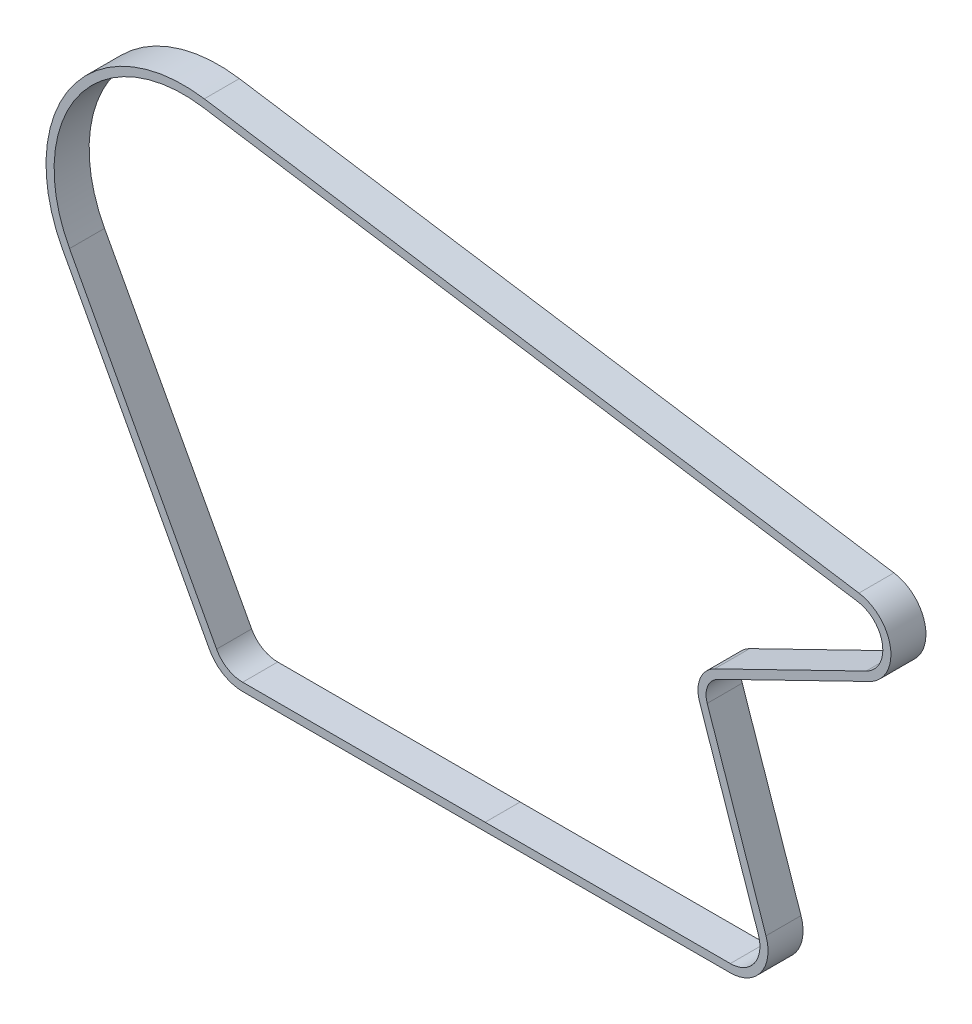
ISO-10303-21;
HEADER;
FILE_DESCRIPTION(('STEP AP214'),'2;1');
FILE_NAME('part.step','',(''),(''),'','','');
FILE_SCHEMA(('AUTOMOTIVE_DESIGN { 1 0 10303 214 1 1 1 1 }'));
ENDSEC;
DATA;
#1=APPLICATION_CONTEXT('core data for automotive mechanical design processes');
#2=APPLICATION_PROTOCOL_DEFINITION('international standard','automotive_design',2000,#1);
#3=PRODUCT_CONTEXT('',#1,'mechanical');
#4=PRODUCT('Part','Part','',(#3));
#5=PRODUCT_RELATED_PRODUCT_CATEGORY('part','',(#4));
#6=PRODUCT_DEFINITION_FORMATION('','',#4);
#7=PRODUCT_DEFINITION_CONTEXT('part definition',#1,'design');
#8=PRODUCT_DEFINITION('design','',#6,#7);
#9=PRODUCT_DEFINITION_SHAPE('','',#8);
#10=(LENGTH_UNIT() NAMED_UNIT(*) SI_UNIT(.MILLI.,.METRE.));
#11=(NAMED_UNIT(*) PLANE_ANGLE_UNIT() SI_UNIT($,.RADIAN.));
#12=(NAMED_UNIT(*) SI_UNIT($,.STERADIAN.) SOLID_ANGLE_UNIT());
#13=UNCERTAINTY_MEASURE_WITH_UNIT(LENGTH_MEASURE(1.E-05),#10,'distance_accuracy_value','');
#14=(GEOMETRIC_REPRESENTATION_CONTEXT(3) GLOBAL_UNCERTAINTY_ASSIGNED_CONTEXT((#13)) GLOBAL_UNIT_ASSIGNED_CONTEXT((#10,
#11,#12)) REPRESENTATION_CONTEXT('',''));
#15=CARTESIAN_POINT('',(0.,0.,0.));
#16=DIRECTION('',(0.,0.,1.));
#17=DIRECTION('',(1.,0.,0.));
#18=AXIS2_PLACEMENT_3D('',#15,#16,#17);
#19=CARTESIAN_POINT('',(0.,0.,-3.));
#20=DIRECTION('',(0.,0.,1.));
#21=DIRECTION('',(1.,0.,0.));
#22=AXIS2_PLACEMENT_3D('',#19,#20,#21);
#23=CYLINDRICAL_SURFACE('',#22,14.);
#24=DIRECTION('',(0.,0.,1.));
#25=VECTOR('',#24,1.);
#26=CARTESIAN_POINT('',(2.12894407419056,13.8371816902492,-3.00000000000001));
#27=LINE('',#26,#25);
#28=CARTESIAN_POINT('',(2.12894407419056,13.8371816902492,-3.00000000000001));
#29=VERTEX_POINT('',#28);
#30=CARTESIAN_POINT('',(2.12894407419056,13.8371816902492,9.99999999999999));
#31=VERTEX_POINT('',#30);
#32=EDGE_CURVE('E184',#29,#31,#27,.T.);
#33=ORIENTED_EDGE('',*,*,#32,.T.);
#34=CARTESIAN_POINT('',(0.,0.,10.));
#35=DIRECTION('',(0.,0.,-1.));
#36=DIRECTION('',(-1.,0.,0.));
#37=AXIS2_PLACEMENT_3D('',#34,#35,#36);
#38=CIRCLE('',#37,14.);
#39=CARTESIAN_POINT('',(6.13273082439338,-12.5852935061339,10.));
#40=VERTEX_POINT('',#39);
#41=EDGE_CURVE('E397',#40,#31,#38,.F.);
#42=ORIENTED_EDGE('',*,*,#41,.F.);
#43=DIRECTION('',(0.,0.,1.));
#44=VECTOR('',#43,1.);
#45=CARTESIAN_POINT('',(6.13273082439338,-12.5852935061339,-3.));
#46=LINE('',#45,#44);
#47=CARTESIAN_POINT('',(6.13273082439338,-12.5852935061339,-3.));
#48=VERTEX_POINT('',#47);
#49=EDGE_CURVE('E12',#48,#40,#46,.T.);
#50=ORIENTED_EDGE('',*,*,#49,.F.);
#51=CARTESIAN_POINT('',(0.,0.,-3.));
#52=DIRECTION('',(0.,0.,-1.));
#53=DIRECTION('',(-1.,0.,0.));
#54=AXIS2_PLACEMENT_3D('',#51,#52,#53);
#55=CIRCLE('',#54,14.);
#56=EDGE_CURVE('E464',#48,#29,#55,.F.);
#57=ORIENTED_EDGE('',*,*,#56,.T.);
#58=EDGE_LOOP('',(#33,#42,#50,#57));
#59=FACE_BOUND('',#58,.T.);
#60=ADVANCED_FACE('F181',(#59),#23,.T.);
#61=CARTESIAN_POINT('',(6.13273082439338,-12.5852935061339,-3.));
#62=DIRECTION('',(0.438052201742384,-0.898949536152419,0.));
#63=DIRECTION('',(0.898949536152419,0.438052201742384,0.));
#64=AXIS2_PLACEMENT_3D('',#61,#62,#63);
#65=PLANE('',#64);
#66=ORIENTED_EDGE('',*,*,#49,.T.);
#67=DIRECTION('',(0.898949536152419,0.438052201742385,0.));
#68=VECTOR('',#67,1.);
#69=CARTESIAN_POINT('',(6.13273082439338,-12.5852935061339,10.));
#70=LINE('',#69,#68);
#71=CARTESIAN_POINT('',(-50.1157210314522,-39.9947944726886,10.));
#72=VERTEX_POINT('',#71);
#73=EDGE_CURVE('E430',#72,#40,#70,.T.);
#74=ORIENTED_EDGE('',*,*,#73,.F.);
#75=DIRECTION('',(0.,0.,1.));
#76=VECTOR('',#75,1.);
#77=CARTESIAN_POINT('',(-50.1157210314522,-39.9947944726886,-3.));
#78=LINE('',#77,#76);
#79=CARTESIAN_POINT('',(-50.1157210314522,-39.9947944726886,-3.));
#80=VERTEX_POINT('',#79);
#81=EDGE_CURVE('E189',#80,#72,#78,.T.);
#82=ORIENTED_EDGE('',*,*,#81,.F.);
#83=DIRECTION('',(0.898949536152419,0.438052201742385,0.));
#84=VECTOR('',#83,1.);
#85=CARTESIAN_POINT('',(6.13273082439338,-12.5852935061339,-3.));
#86=LINE('',#85,#84);
#87=EDGE_CURVE('E515',#80,#48,#86,.T.);
#88=ORIENTED_EDGE('',*,*,#87,.T.);
#89=EDGE_LOOP('',(#66,#74,#82,#88));
#90=FACE_BOUND('',#89,.T.);
#91=ADVANCED_FACE('F544',(#90),#65,.T.);
#92=CARTESIAN_POINT('',(-46.6113034175132,-47.186390761908,-3.));
#93=DIRECTION('',(0.,0.,1.));
#94=DIRECTION('',(1.,0.,0.));
#95=AXIS2_PLACEMENT_3D('',#92,#93,#94);
#96=CYLINDRICAL_SURFACE('',#95,8.);
#97=ORIENTED_EDGE('',*,*,#81,.T.);
#98=CARTESIAN_POINT('',(-46.6113034175132,-47.186390761908,10.));
#99=DIRECTION('',(0.,0.,-1.));
#100=DIRECTION('',(-1.,0.,0.));
#101=AXIS2_PLACEMENT_3D('',#98,#99,#100);
#102=CIRCLE('',#101,8.);
#103=CARTESIAN_POINT('',(-54.1812298303165,-49.7740951702094,10.));
#104=VERTEX_POINT('',#103);
#105=EDGE_CURVE('E427',#104,#72,#102,.T.);
#106=ORIENTED_EDGE('',*,*,#105,.F.);
#107=DIRECTION('',(0.,0.,1.));
#108=VECTOR('',#107,1.);
#109=CARTESIAN_POINT('',(-54.1812298303165,-49.7740951702094,-3.));
#110=LINE('',#109,#108);
#111=CARTESIAN_POINT('',(-54.1812298303165,-49.7740951702094,-3.));
#112=VERTEX_POINT('',#111);
#113=EDGE_CURVE('E519',#112,#104,#110,.T.);
#114=ORIENTED_EDGE('',*,*,#113,.F.);
#115=CARTESIAN_POINT('',(-46.6113034175132,-47.186390761908,-3.));
#116=DIRECTION('',(0.,0.,-1.));
#117=DIRECTION('',(-1.,0.,0.));
#118=AXIS2_PLACEMENT_3D('',#115,#116,#117);
#119=CIRCLE('',#118,8.);
#120=EDGE_CURVE('E512',#112,#80,#119,.T.);
#121=ORIENTED_EDGE('',*,*,#120,.T.);
#122=EDGE_LOOP('',(#97,#106,#114,#121));
#123=FACE_BOUND('',#122,.T.);
#124=ADVANCED_FACE('F581',(#123),#96,.F.);
#125=CARTESIAN_POINT('',(-63.7468906566856,-21.7912435302957,-3.));
#126=DIRECTION('',(0.946240801600415,0.323463051037679,0.));
#127=DIRECTION('',(-0.323463051037679,0.946240801600415,0.));
#128=AXIS2_PLACEMENT_3D('',#125,#126,#127);
#129=PLANE('',#128);
#130=ORIENTED_EDGE('',*,*,#113,.T.);
#131=DIRECTION('',(-0.323463051037679,0.946240801600415,0.));
#132=VECTOR('',#131,1.);
#133=CARTESIAN_POINT('',(-63.7468906566856,-21.7912435302957,10.));
#134=LINE('',#133,#132);
#135=CARTESIAN_POINT('',(-32.3664515161559,-113.58983317338,10.));
#136=VERTEX_POINT('',#135);
#137=EDGE_CURVE('E424',#136,#104,#134,.T.);
#138=ORIENTED_EDGE('',*,*,#137,.F.);
#139=DIRECTION('',(0.,0.,1.));
#140=VECTOR('',#139,1.);
#141=CARTESIAN_POINT('',(-32.3664515161559,-113.58983317338,-3.));
#142=LINE('',#141,#140);
#143=CARTESIAN_POINT('',(-32.3664515161559,-113.58983317338,-3.));
#144=VERTEX_POINT('',#143);
#145=EDGE_CURVE('E521',#144,#136,#142,.T.);
#146=ORIENTED_EDGE('',*,*,#145,.F.);
#147=DIRECTION('',(-0.323463051037679,0.946240801600415,0.));
#148=VECTOR('',#147,1.);
#149=CARTESIAN_POINT('',(-63.7468906566856,-21.7912435302957,-3.));
#150=LINE('',#149,#148);
#151=EDGE_CURVE('E509',#144,#112,#150,.T.);
#152=ORIENTED_EDGE('',*,*,#151,.T.);
#153=EDGE_LOOP('',(#130,#138,#146,#152));
#154=FACE_BOUND('',#153,.T.);
#155=ADVANCED_FACE('F579',(#154),#129,.T.);
#156=CARTESIAN_POINT('',(-45.6138227385618,-118.118315887907,-3.));
#157=DIRECTION('',(0.,0.,1.));
#158=DIRECTION('',(1.,0.,0.));
#159=AXIS2_PLACEMENT_3D('',#156,#157,#158);
#160=CYLINDRICAL_SURFACE('',#159,14.);
#161=ORIENTED_EDGE('',*,*,#145,.T.);
#162=CARTESIAN_POINT('',(-45.6138227385618,-118.118315887907,10.));
#163=DIRECTION('',(0.,0.,-1.));
#164=DIRECTION('',(-1.,0.,0.));
#165=AXIS2_PLACEMENT_3D('',#162,#163,#164);
#166=CIRCLE('',#165,14.);
#167=CARTESIAN_POINT('',(-45.6033488760485,-132.118311969985,10.));
#168=VERTEX_POINT('',#167);
#169=EDGE_CURVE('E421',#168,#136,#166,.F.);
#170=ORIENTED_EDGE('',*,*,#169,.F.);
#171=DIRECTION('',(0.,0.,1.));
#172=VECTOR('',#171,1.);
#173=CARTESIAN_POINT('',(-45.6033488760485,-132.118311969985,-3.));
#174=LINE('',#173,#172);
#175=CARTESIAN_POINT('',(-45.6033488760485,-132.118311969985,-3.));
#176=VERTEX_POINT('',#175);
#177=EDGE_CURVE('E523',#176,#168,#174,.T.);
#178=ORIENTED_EDGE('',*,*,#177,.F.);
#179=CARTESIAN_POINT('',(-45.6138227385618,-118.118315887907,-3.));
#180=DIRECTION('',(0.,0.,-1.));
#181=DIRECTION('',(-1.,0.,0.));
#182=AXIS2_PLACEMENT_3D('',#179,#180,#181);
#183=CIRCLE('',#182,14.);
#184=EDGE_CURVE('E506',#176,#144,#183,.F.);
#185=ORIENTED_EDGE('',*,*,#184,.T.);
#186=EDGE_LOOP('',(#161,#170,#178,#185));
#187=FACE_BOUND('',#186,.T.);
#188=ADVANCED_FACE('F575',(#187),#160,.T.);
#189=CARTESIAN_POINT('',(0.0988165219381348,-132.084120660636,-3.));
#190=DIRECTION('',(0.000748133036658257,-0.999999720148441,0.));
#191=DIRECTION('',(0.999999720148441,0.000748133036658257,0.));
#192=AXIS2_PLACEMENT_3D('',#189,#190,#191);
#193=PLANE('',#192);
#194=ORIENTED_EDGE('',*,*,#177,.T.);
#195=DIRECTION('',(0.999999720148441,0.000748133036658257,0.));
#196=VECTOR('',#195,1.);
#197=CARTESIAN_POINT('',(0.0988165219381348,-132.084120660636,10.));
#198=LINE('',#197,#196);
#199=CARTESIAN_POINT('',(-136.596329555,-132.186386843986,10.));
#200=VERTEX_POINT('',#199);
#201=EDGE_CURVE('E418',#200,#168,#198,.T.);
#202=ORIENTED_EDGE('',*,*,#201,.F.);
#203=DIRECTION('',(0.,0.,1.));
#204=VECTOR('',#203,1.);
#205=CARTESIAN_POINT('',(-136.596329555,-132.186386843986,-3.));
#206=LINE('',#205,#204);
#207=CARTESIAN_POINT('',(-136.596329555,-132.186386843986,-3.));
#208=VERTEX_POINT('',#207);
#209=EDGE_CURVE('E525',#208,#200,#206,.T.);
#210=ORIENTED_EDGE('',*,*,#209,.F.);
#211=DIRECTION('',(0.999999720148441,0.000748133036658257,0.));
#212=VECTOR('',#211,1.);
#213=CARTESIAN_POINT('',(0.0988165219381348,-132.084120660636,-3.));
#214=LINE('',#213,#212);
#215=EDGE_CURVE('E503',#208,#176,#214,.T.);
#216=ORIENTED_EDGE('',*,*,#215,.T.);
#217=EDGE_LOOP('',(#194,#202,#210,#216));
#218=FACE_BOUND('',#217,.T.);
#219=ADVANCED_FACE('F572',(#218),#193,.T.);
#220=CARTESIAN_POINT('',(-136.606803417513,-118.186390761908,-3.));
#221=DIRECTION('',(0.,0.,1.));
#222=DIRECTION('',(1.,0.,0.));
#223=AXIS2_PLACEMENT_3D('',#220,#221,#222);
#224=CYLINDRICAL_SURFACE('',#223,14.);
#225=ORIENTED_EDGE('',*,*,#209,.T.);
#226=CARTESIAN_POINT('',(-136.606803417513,-118.186390761908,10.));
#227=DIRECTION('',(0.,0.,-1.));
#228=DIRECTION('',(-1.,0.,0.));
#229=AXIS2_PLACEMENT_3D('',#226,#227,#228);
#230=CIRCLE('',#229,14.);
#231=CARTESIAN_POINT('',(-136.606803417514,-132.186390761908,10.));
#232=VERTEX_POINT('',#231);
#233=EDGE_CURVE('E415',#232,#200,#230,.F.);
#234=ORIENTED_EDGE('',*,*,#233,.F.);
#235=DIRECTION('',(0.,0.,1.));
#236=VECTOR('',#235,1.);
#237=CARTESIAN_POINT('',(-136.606803417514,-132.186390761908,-3.));
#238=LINE('',#237,#236);
#239=CARTESIAN_POINT('',(-136.606803417514,-132.186390761908,-3.));
#240=VERTEX_POINT('',#239);
#241=EDGE_CURVE('E527',#240,#232,#238,.T.);
#242=ORIENTED_EDGE('',*,*,#241,.F.);
#243=CARTESIAN_POINT('',(-136.606803417513,-118.186390761908,-3.));
#244=DIRECTION('',(0.,0.,-1.));
#245=DIRECTION('',(-1.,0.,0.));
#246=AXIS2_PLACEMENT_3D('',#243,#244,#245);
#247=CIRCLE('',#246,14.);
#248=EDGE_CURVE('E500',#240,#208,#247,.F.);
#249=ORIENTED_EDGE('',*,*,#248,.T.);
#250=EDGE_LOOP('',(#225,#234,#242,#249));
#251=FACE_BOUND('',#250,.T.);
#252=ADVANCED_FACE('F570',(#251),#224,.T.);
#253=CARTESIAN_POINT('',(-4.07676979865585E-12,-132.186390761912,-3.));
#254=DIRECTION('',(0.,-1.,0.));
#255=DIRECTION('',(1.,0.,0.));
#256=AXIS2_PLACEMENT_3D('',#253,#254,#255);
#257=PLANE('',#256);
#258=ORIENTED_EDGE('',*,*,#241,.T.);
#259=DIRECTION('',(1.,0.,0.));
#260=VECTOR('',#259,1.);
#261=CARTESIAN_POINT('',(-4.07676979865585E-12,-132.186390761912,10.));
#262=LINE('',#261,#260);
#263=CARTESIAN_POINT('',(-226.602303417514,-132.186390761905,10.));
#264=VERTEX_POINT('',#263);
#265=EDGE_CURVE('E412',#264,#232,#262,.T.);
#266=ORIENTED_EDGE('',*,*,#265,.F.);
#267=DIRECTION('',(0.,0.,1.));
#268=VECTOR('',#267,1.);
#269=CARTESIAN_POINT('',(-226.602303417514,-132.186390761905,-3.));
#270=LINE('',#269,#268);
#271=CARTESIAN_POINT('',(-226.602303417514,-132.186390761905,-3.));
#272=VERTEX_POINT('',#271);
#273=EDGE_CURVE('E529',#272,#264,#270,.T.);
#274=ORIENTED_EDGE('',*,*,#273,.F.);
#275=DIRECTION('',(1.,0.,0.));
#276=VECTOR('',#275,1.);
#277=CARTESIAN_POINT('',(-4.07676979865585E-12,-132.186390761912,-3.));
#278=LINE('',#277,#276);
#279=EDGE_CURVE('E497',#272,#240,#278,.T.);
#280=ORIENTED_EDGE('',*,*,#279,.T.);
#281=EDGE_LOOP('',(#258,#266,#274,#280));
#282=FACE_BOUND('',#281,.T.);
#283=ADVANCED_FACE('F565',(#282),#257,.T.);
#284=CARTESIAN_POINT('',(-226.602303417513,-118.186390761905,-3.));
#285=DIRECTION('',(0.,0.,1.));
#286=DIRECTION('',(1.,0.,0.));
#287=AXIS2_PLACEMENT_3D('',#284,#285,#286);
#288=CYLINDRICAL_SURFACE('',#287,14.);
#289=ORIENTED_EDGE('',*,*,#273,.T.);
#290=CARTESIAN_POINT('',(-226.602303417513,-118.186390761905,10.));
#291=DIRECTION('',(0.,0.,-1.));
#292=DIRECTION('',(-1.,0.,0.));
#293=AXIS2_PLACEMENT_3D('',#290,#291,#292);
#294=CIRCLE('',#293,14.);
#295=CARTESIAN_POINT('',(-238.931690822964,-124.818600514794,10.));
#296=VERTEX_POINT('',#295);
#297=EDGE_CURVE('E409',#296,#264,#294,.F.);
#298=ORIENTED_EDGE('',*,*,#297,.F.);
#299=DIRECTION('',(0.,0.,1.));
#300=VECTOR('',#299,1.);
#301=CARTESIAN_POINT('',(-238.931690822964,-124.818600514794,-3.));
#302=LINE('',#301,#300);
#303=CARTESIAN_POINT('',(-238.931690822964,-124.818600514794,-3.));
#304=VERTEX_POINT('',#303);
#305=EDGE_CURVE('E531',#304,#296,#302,.T.);
#306=ORIENTED_EDGE('',*,*,#305,.F.);
#307=CARTESIAN_POINT('',(-226.602303417513,-118.186390761905,-3.));
#308=DIRECTION('',(0.,0.,-1.));
#309=DIRECTION('',(-1.,0.,0.));
#310=AXIS2_PLACEMENT_3D('',#307,#308,#309);
#311=CIRCLE('',#310,14.);
#312=EDGE_CURVE('E494',#304,#272,#311,.F.);
#313=ORIENTED_EDGE('',*,*,#312,.T.);
#314=EDGE_LOOP('',(#289,#298,#306,#313));
#315=FACE_BOUND('',#314,.T.);
#316=ADVANCED_FACE('F560',(#315),#288,.T.);
#317=CARTESIAN_POINT('',(-237.385025366339,-127.693877128754,-3.));
#318=DIRECTION('',(-0.880670528960759,-0.473729268063497,0.));
#319=DIRECTION('',(0.473729268063497,-0.880670528960759,0.));
#320=AXIS2_PLACEMENT_3D('',#317,#318,#319);
#321=PLANE('',#320);
#322=ORIENTED_EDGE('',*,*,#305,.T.);
#323=DIRECTION('',(0.473729268063497,-0.880670528960759,0.));
#324=VECTOR('',#323,1.);
#325=CARTESIAN_POINT('',(-237.385025366339,-127.693877128754,10.));
#326=LINE('',#325,#324);
#327=CARTESIAN_POINT('',(-293.515400394512,-23.3465834331463,10.));
#328=VERTEX_POINT('',#327);
#329=EDGE_CURVE('E406',#328,#296,#326,.T.);
#330=ORIENTED_EDGE('',*,*,#329,.F.);
#331=DIRECTION('',(0.,0.,1.));
#332=VECTOR('',#331,1.);
#333=CARTESIAN_POINT('',(-293.515400394512,-23.3465834331463,-3.));
#334=LINE('',#333,#332);
#335=CARTESIAN_POINT('',(-293.515400394512,-23.3465834331463,-3.));
#336=VERTEX_POINT('',#335);
#337=EDGE_CURVE('E533',#336,#328,#334,.T.);
#338=ORIENTED_EDGE('',*,*,#337,.F.);
#339=DIRECTION('',(0.473729268063497,-0.880670528960759,0.));
#340=VECTOR('',#339,1.);
#341=CARTESIAN_POINT('',(-237.385025366339,-127.693877128754,-3.));
#342=LINE('',#341,#340);
#343=EDGE_CURVE('E491',#336,#304,#342,.T.);
#344=ORIENTED_EDGE('',*,*,#343,.T.);
#345=EDGE_LOOP('',(#322,#330,#338,#344));
#346=FACE_BOUND('',#345,.T.);
#347=ADVANCED_FACE('F558',(#346),#321,.T.);
#348=CARTESIAN_POINT('',(-248.601203417513,0.813609238092039,-3.));
#349=DIRECTION('',(0.,0.,1.));
#350=DIRECTION('',(1.,0.,0.));
#351=AXIS2_PLACEMENT_3D('',#348,#349,#350);
#352=CYLINDRICAL_SURFACE('',#351,51.);
#353=ORIENTED_EDGE('',*,*,#337,.T.);
#354=CARTESIAN_POINT('',(-248.601203417513,0.813609238092039,10.));
#355=DIRECTION('',(0.,0.,-1.));
#356=DIRECTION('',(-1.,0.,0.));
#357=AXIS2_PLACEMENT_3D('',#354,#355,#356);
#358=CIRCLE('',#357,51.);
#359=CARTESIAN_POINT('',(-240.845764290105,51.2204853954286,9.99999999999999));
#360=VERTEX_POINT('',#359);
#361=EDGE_CURVE('E403',#360,#328,#358,.F.);
#362=ORIENTED_EDGE('',*,*,#361,.F.);
#363=DIRECTION('',(0.,0.,1.));
#364=VECTOR('',#363,1.);
#365=CARTESIAN_POINT('',(-240.845764290105,51.2204853954286,-3.00000000000001));
#366=LINE('',#365,#364);
#367=CARTESIAN_POINT('',(-240.845764290105,51.2204853954286,-3.00000000000001));
#368=VERTEX_POINT('',#367);
#369=EDGE_CURVE('E534',#368,#360,#366,.T.);
#370=ORIENTED_EDGE('',*,*,#369,.F.);
#371=CARTESIAN_POINT('',(-248.601203417513,0.813609238092039,-3.));
#372=DIRECTION('',(0.,0.,-1.));
#373=DIRECTION('',(-1.,0.,0.));
#374=AXIS2_PLACEMENT_3D('',#371,#372,#373);
#375=CIRCLE('',#374,51.);
#376=EDGE_CURVE('E488',#368,#336,#375,.F.);
#377=ORIENTED_EDGE('',*,*,#376,.T.);
#378=EDGE_LOOP('',(#353,#362,#370,#377));
#379=FACE_BOUND('',#378,.T.);
#380=ADVANCED_FACE('F554',(#379),#352,.T.);
#381=CARTESIAN_POINT('',(2.12894407419051,13.8371816902492,-3.));
#382=DIRECTION('',(0.152067433870751,0.988370120732089,0.));
#383=DIRECTION('',(-0.988370120732089,0.152067433870751,0.));
#384=AXIS2_PLACEMENT_3D('',#381,#382,#383);
#385=PLANE('',#384);
#386=ORIENTED_EDGE('',*,*,#369,.T.);
#387=DIRECTION('',(-0.988370120732089,0.152067433870751,0.));
#388=VECTOR('',#387,1.);
#389=CARTESIAN_POINT('',(2.12894407419051,13.8371816902492,10.));
#390=LINE('',#389,#388);
#391=EDGE_CURVE('E400',#31,#360,#390,.T.);
#392=ORIENTED_EDGE('',*,*,#391,.F.);
#393=ORIENTED_EDGE('',*,*,#32,.F.);
#394=DIRECTION('',(-0.988370120732089,0.152067433870751,0.));
#395=VECTOR('',#394,1.);
#396=CARTESIAN_POINT('',(2.12894407419051,13.8371816902492,-3.));
#397=LINE('',#396,#395);
#398=EDGE_CURVE('E485',#29,#368,#397,.T.);
#399=ORIENTED_EDGE('',*,*,#398,.T.);
#400=EDGE_LOOP('',(#386,#392,#393,#399));
#401=FACE_BOUND('',#400,.T.);
#402=ADVANCED_FACE('F538',(#401),#385,.T.);
#403=CARTESIAN_POINT('',(0.,0.,-3.));
#404=DIRECTION('',(0.,0.,-1.));
#405=DIRECTION('',(-1.,0.,0.));
#406=AXIS2_PLACEMENT_3D('',#403,#404,#405);
#407=PLANE('',#406);
#408=CARTESIAN_POINT('',(0.,0.,-3.));
#409=DIRECTION('',(0.,0.,1.));
#410=DIRECTION('',(-1.,0.,0.));
#411=AXIS2_PLACEMENT_3D('',#408,#409,#410);
#412=CIRCLE('',#411,11.);
#413=CARTESIAN_POINT('',(4.81857421916623,-9.88844489767661,-3.));
#414=VERTEX_POINT('',#413);
#415=CARTESIAN_POINT('',(1.67274177257826,10.872071328053,-3.));
#416=VERTEX_POINT('',#415);
#417=EDGE_CURVE('E433',#414,#416,#412,.T.);
#418=ORIENTED_EDGE('',*,*,#417,.T.);
#419=DIRECTION('',(-0.988370120732089,0.152067433870751,0.));
#420=VECTOR('',#419,1.);
#421=CARTESIAN_POINT('',(-241.301966591717,48.2553750332323,-3.));
#422=LINE('',#421,#420);
#423=CARTESIAN_POINT('',(-241.301966591717,48.2553750332323,-3.));
#424=VERTEX_POINT('',#423);
#425=EDGE_CURVE('E349',#416,#424,#422,.T.);
#426=ORIENTED_EDGE('',*,*,#425,.T.);
#427=CARTESIAN_POINT('',(-248.601203417513,0.813609238092039,-3.));
#428=DIRECTION('',(0.,0.,1.));
#429=DIRECTION('',(-1.,0.,0.));
#430=AXIS2_PLACEMENT_3D('',#427,#428,#429);
#431=CIRCLE('',#430,48.);
#432=CARTESIAN_POINT('',(-290.87338880763,-21.9253956289559,-3.));
#433=VERTEX_POINT('',#432);
#434=EDGE_CURVE('E197',#424,#433,#431,.T.);
#435=ORIENTED_EDGE('',*,*,#434,.T.);
#436=DIRECTION('',(0.473729268063497,-0.880670528960759,0.));
#437=VECTOR('',#436,1.);
#438=CARTESIAN_POINT('',(-236.289679236081,-123.397412710604,-3.));
#439=LINE('',#438,#437);
#440=CARTESIAN_POINT('',(-236.289679236081,-123.397412710604,-3.));
#441=VERTEX_POINT('',#440);
#442=EDGE_CURVE('E437',#433,#441,#439,.T.);
#443=ORIENTED_EDGE('',*,*,#442,.T.);
#444=CARTESIAN_POINT('',(-226.602303417513,-118.186390761905,-3.));
#445=DIRECTION('',(0.,0.,1.));
#446=DIRECTION('',(-1.,0.,0.));
#447=AXIS2_PLACEMENT_3D('',#444,#445,#446);
#448=CIRCLE('',#447,11.);
#449=CARTESIAN_POINT('',(-226.602303417513,-129.186390761905,-3.));
#450=VERTEX_POINT('',#449);
#451=EDGE_CURVE('E440',#441,#450,#448,.T.);
#452=ORIENTED_EDGE('',*,*,#451,.T.);
#453=DIRECTION('',(1.,0.,0.));
#454=VECTOR('',#453,1.);
#455=CARTESIAN_POINT('',(-136.606803417514,-129.186390761908,-3.));
#456=LINE('',#455,#454);
#457=CARTESIAN_POINT('',(-136.606803417514,-129.186390761908,-3.));
#458=VERTEX_POINT('',#457);
#459=EDGE_CURVE('E443',#450,#458,#456,.T.);
#460=ORIENTED_EDGE('',*,*,#459,.T.);
#461=CARTESIAN_POINT('',(-136.606803417513,-118.186390761908,-3.));
#462=DIRECTION('',(0.,0.,1.));
#463=DIRECTION('',(-1.,0.,0.));
#464=AXIS2_PLACEMENT_3D('',#461,#462,#463);
#465=CIRCLE('',#464,11.);
#466=CARTESIAN_POINT('',(-136.59857395411,-129.186387683541,-3.));
#467=VERTEX_POINT('',#466);
#468=EDGE_CURVE('E446',#458,#467,#465,.T.);
#469=ORIENTED_EDGE('',*,*,#468,.T.);
#470=DIRECTION('',(0.999999720148441,0.000748133036658257,0.));
#471=VECTOR('',#470,1.);
#472=CARTESIAN_POINT('',(-45.6055932751585,-129.11831280954,-3.));
#473=LINE('',#472,#471);
#474=CARTESIAN_POINT('',(-45.6055932751585,-129.11831280954,-3.));
#475=VERTEX_POINT('',#474);
#476=EDGE_CURVE('E449',#467,#475,#473,.T.);
#477=ORIENTED_EDGE('',*,*,#476,.T.);
#478=CARTESIAN_POINT('',(-45.6138227385618,-118.118315887907,-3.));
#479=DIRECTION('',(0.,0.,1.));
#480=DIRECTION('',(-1.,0.,0.));
#481=AXIS2_PLACEMENT_3D('',#478,#479,#480);
#482=CIRCLE('',#481,11.);
#483=CARTESIAN_POINT('',(-35.2051739209572,-114.560222326493,-3.));
#484=VERTEX_POINT('',#483);
#485=EDGE_CURVE('E452',#475,#484,#482,.T.);
#486=ORIENTED_EDGE('',*,*,#485,.T.);
#487=DIRECTION('',(-0.323463051037679,0.946240801600415,0.));
#488=VECTOR('',#487,1.);
#489=CARTESIAN_POINT('',(-57.0199522351177,-50.7444843233225,-3.));
#490=LINE('',#489,#488);
#491=CARTESIAN_POINT('',(-57.0199522351177,-50.7444843233225,-3.));
#492=VERTEX_POINT('',#491);
#493=EDGE_CURVE('E455',#484,#492,#490,.T.);
#494=ORIENTED_EDGE('',*,*,#493,.T.);
#495=CARTESIAN_POINT('',(-46.6113034175132,-47.186390761908,-3.));
#496=DIRECTION('',(0.,0.,-1.));
#497=DIRECTION('',(1.,0.,0.));
#498=AXIS2_PLACEMENT_3D('',#495,#496,#497);
#499=CIRCLE('',#498,11.);
#500=CARTESIAN_POINT('',(-51.4298776366794,-37.2979458642314,-3.));
#501=VERTEX_POINT('',#500);
#502=EDGE_CURVE('E458',#492,#501,#499,.T.);
#503=ORIENTED_EDGE('',*,*,#502,.T.);
#504=DIRECTION('',(0.898949536152419,0.438052201742385,0.));
#505=VECTOR('',#504,1.);
#506=CARTESIAN_POINT('',(4.81857421916623,-9.88844489767661,-3.));
#507=LINE('',#506,#505);
#508=EDGE_CURVE('E354',#501,#414,#507,.T.);
#509=ORIENTED_EDGE('',*,*,#508,.T.);
#510=EDGE_LOOP('',(#418,#426,#435,#443,#452,#460,#469,#477,#486,#494,#503,#509));
#511=FACE_BOUND('',#510,.T.);
#512=ORIENTED_EDGE('',*,*,#56,.F.);
#513=ORIENTED_EDGE('',*,*,#87,.F.);
#514=ORIENTED_EDGE('',*,*,#120,.F.);
#515=ORIENTED_EDGE('',*,*,#151,.F.);
#516=ORIENTED_EDGE('',*,*,#184,.F.);
#517=ORIENTED_EDGE('',*,*,#215,.F.);
#518=ORIENTED_EDGE('',*,*,#248,.F.);
#519=ORIENTED_EDGE('',*,*,#279,.F.);
#520=ORIENTED_EDGE('',*,*,#312,.F.);
#521=ORIENTED_EDGE('',*,*,#343,.F.);
#522=ORIENTED_EDGE('',*,*,#376,.F.);
#523=ORIENTED_EDGE('',*,*,#398,.F.);
#524=EDGE_LOOP('',(#512,#513,#514,#515,#516,#517,#518,#519,#520,#521,#522,#523));
#525=FACE_BOUND('',#524,.T.);
#526=ADVANCED_FACE('F548',(#511,#525),#407,.T.);
#527=CARTESIAN_POINT('',(0.,0.,-3.));
#528=DIRECTION('',(0.,0.,1.));
#529=DIRECTION('',(1.,0.,0.));
#530=AXIS2_PLACEMENT_3D('',#527,#528,#529);
#531=CYLINDRICAL_SURFACE('',#530,11.);
#532=DIRECTION('',(0.,0.,1.));
#533=VECTOR('',#532,1.);
#534=CARTESIAN_POINT('',(4.81857421916623,-9.88844489767661,-3.));
#535=LINE('',#534,#533);
#536=CARTESIAN_POINT('',(4.81857421916623,-9.88844489767661,10.));
#537=VERTEX_POINT('',#536);
#538=EDGE_CURVE('E359',#414,#537,#535,.T.);
#539=ORIENTED_EDGE('',*,*,#538,.T.);
#540=CARTESIAN_POINT('',(0.,0.,10.));
#541=DIRECTION('',(0.,0.,1.));
#542=DIRECTION('',(-1.,0.,0.));
#543=AXIS2_PLACEMENT_3D('',#540,#541,#542);
#544=CIRCLE('',#543,11.);
#545=CARTESIAN_POINT('',(1.67274177257826,10.872071328053,10.));
#546=VERTEX_POINT('',#545);
#547=EDGE_CURVE('E357',#537,#546,#544,.T.);
#548=ORIENTED_EDGE('',*,*,#547,.T.);
#549=DIRECTION('',(0.,0.,1.));
#550=VECTOR('',#549,1.);
#551=CARTESIAN_POINT('',(1.67274177257826,10.872071328053,-3.));
#552=LINE('',#551,#550);
#553=EDGE_CURVE('E342',#416,#546,#552,.T.);
#554=ORIENTED_EDGE('',*,*,#553,.F.);
#555=ORIENTED_EDGE('',*,*,#417,.F.);
#556=EDGE_LOOP('',(#539,#548,#554,#555));
#557=FACE_BOUND('',#556,.T.);
#558=ADVANCED_FACE('F358',(#557),#531,.F.);
#559=CARTESIAN_POINT('',(4.81857421916623,-9.88844489767661,-3.));
#560=DIRECTION('',(0.438052201742384,-0.898949536152419,0.));
#561=DIRECTION('',(0.898949536152419,0.438052201742385,0.));
#562=AXIS2_PLACEMENT_3D('',#559,#560,#561);
#563=PLANE('',#562);
#564=DIRECTION('',(0.,0.,1.));
#565=VECTOR('',#564,1.);
#566=CARTESIAN_POINT('',(-51.4298776366794,-37.2979458642314,-3.));
#567=LINE('',#566,#565);
#568=CARTESIAN_POINT('',(-51.4298776366794,-37.2979458642314,10.));
#569=VERTEX_POINT('',#568);
#570=EDGE_CURVE('E465',#501,#569,#567,.T.);
#571=ORIENTED_EDGE('',*,*,#570,.T.);
#572=DIRECTION('',(0.898949536152419,0.438052201742385,0.));
#573=VECTOR('',#572,1.);
#574=CARTESIAN_POINT('',(4.81857421916623,-9.88844489767661,10.));
#575=LINE('',#574,#573);
#576=EDGE_CURVE('E395',#569,#537,#575,.T.);
#577=ORIENTED_EDGE('',*,*,#576,.T.);
#578=ORIENTED_EDGE('',*,*,#538,.F.);
#579=ORIENTED_EDGE('',*,*,#508,.F.);
#580=EDGE_LOOP('',(#571,#577,#578,#579));
#581=FACE_BOUND('',#580,.T.);
#582=ADVANCED_FACE('F688',(#581),#563,.F.);
#583=CARTESIAN_POINT('',(-46.6113034175132,-47.186390761908,-3.));
#584=DIRECTION('',(0.,0.,1.));
#585=DIRECTION('',(1.,0.,0.));
#586=AXIS2_PLACEMENT_3D('',#583,#584,#585);
#587=CYLINDRICAL_SURFACE('',#586,11.);
#588=DIRECTION('',(0.,0.,1.));
#589=VECTOR('',#588,1.);
#590=CARTESIAN_POINT('',(-57.0199522351177,-50.7444843233225,-3.));
#591=LINE('',#590,#589);
#592=CARTESIAN_POINT('',(-57.0199522351177,-50.7444843233225,10.));
#593=VERTEX_POINT('',#592);
#594=EDGE_CURVE('E467',#492,#593,#591,.T.);
#595=ORIENTED_EDGE('',*,*,#594,.T.);
#596=CARTESIAN_POINT('',(-46.6113034175132,-47.186390761908,10.));
#597=DIRECTION('',(0.,0.,-1.));
#598=DIRECTION('',(1.,0.,0.));
#599=AXIS2_PLACEMENT_3D('',#596,#597,#598);
#600=CIRCLE('',#599,11.);
#601=EDGE_CURVE('E392',#593,#569,#600,.T.);
#602=ORIENTED_EDGE('',*,*,#601,.T.);
#603=ORIENTED_EDGE('',*,*,#570,.F.);
#604=ORIENTED_EDGE('',*,*,#502,.F.);
#605=EDGE_LOOP('',(#595,#602,#603,#604));
#606=FACE_BOUND('',#605,.T.);
#607=ADVANCED_FACE('F697',(#606),#587,.T.);
#608=CARTESIAN_POINT('',(-57.0199522351177,-50.7444843233225,-3.));
#609=DIRECTION('',(0.946240801600415,0.323463051037679,0.));
#610=DIRECTION('',(-0.323463051037679,0.946240801600415,0.));
#611=AXIS2_PLACEMENT_3D('',#608,#609,#610);
#612=PLANE('',#611);
#613=DIRECTION('',(0.,0.,1.));
#614=VECTOR('',#613,1.);
#615=CARTESIAN_POINT('',(-35.2051739209572,-114.560222326493,-3.));
#616=LINE('',#615,#614);
#617=CARTESIAN_POINT('',(-35.2051739209572,-114.560222326493,10.));
#618=VERTEX_POINT('',#617);
#619=EDGE_CURVE('E469',#484,#618,#616,.T.);
#620=ORIENTED_EDGE('',*,*,#619,.T.);
#621=DIRECTION('',(-0.323463051037679,0.946240801600415,0.));
#622=VECTOR('',#621,1.);
#623=CARTESIAN_POINT('',(-57.0199522351177,-50.7444843233225,10.));
#624=LINE('',#623,#622);
#625=EDGE_CURVE('E389',#618,#593,#624,.T.);
#626=ORIENTED_EDGE('',*,*,#625,.T.);
#627=ORIENTED_EDGE('',*,*,#594,.F.);
#628=ORIENTED_EDGE('',*,*,#493,.F.);
#629=EDGE_LOOP('',(#620,#626,#627,#628));
#630=FACE_BOUND('',#629,.T.);
#631=ADVANCED_FACE('F707',(#630),#612,.F.);
#632=CARTESIAN_POINT('',(-45.6138227385618,-118.118315887907,-3.));
#633=DIRECTION('',(0.,0.,1.));
#634=DIRECTION('',(1.,0.,0.));
#635=AXIS2_PLACEMENT_3D('',#632,#633,#634);
#636=CYLINDRICAL_SURFACE('',#635,11.);
#637=DIRECTION('',(0.,0.,1.));
#638=VECTOR('',#637,1.);
#639=CARTESIAN_POINT('',(-45.6055932751585,-129.11831280954,-3.));
#640=LINE('',#639,#638);
#641=CARTESIAN_POINT('',(-45.6055932751585,-129.11831280954,10.));
#642=VERTEX_POINT('',#641);
#643=EDGE_CURVE('E471',#475,#642,#640,.T.);
#644=ORIENTED_EDGE('',*,*,#643,.T.);
#645=CARTESIAN_POINT('',(-45.6138227385618,-118.118315887907,10.));
#646=DIRECTION('',(0.,0.,1.));
#647=DIRECTION('',(-1.,0.,0.));
#648=AXIS2_PLACEMENT_3D('',#645,#646,#647);
#649=CIRCLE('',#648,11.);
#650=EDGE_CURVE('E386',#642,#618,#649,.T.);
#651=ORIENTED_EDGE('',*,*,#650,.T.);
#652=ORIENTED_EDGE('',*,*,#619,.F.);
#653=ORIENTED_EDGE('',*,*,#485,.F.);
#654=EDGE_LOOP('',(#644,#651,#652,#653));
#655=FACE_BOUND('',#654,.T.);
#656=ADVANCED_FACE('F717',(#655),#636,.F.);
#657=CARTESIAN_POINT('',(-45.6055932751585,-129.11831280954,-3.));
#658=DIRECTION('',(0.000748133036658257,-0.999999720148441,0.));
#659=DIRECTION('',(0.999999720148441,0.000748133036658257,0.));
#660=AXIS2_PLACEMENT_3D('',#657,#658,#659);
#661=PLANE('',#660);
#662=DIRECTION('',(0.,0.,1.));
#663=VECTOR('',#662,1.);
#664=CARTESIAN_POINT('',(-136.59857395411,-129.186387683541,-3.));
#665=LINE('',#664,#663);
#666=CARTESIAN_POINT('',(-136.59857395411,-129.186387683541,10.));
#667=VERTEX_POINT('',#666);
#668=EDGE_CURVE('E473',#467,#667,#665,.T.);
#669=ORIENTED_EDGE('',*,*,#668,.T.);
#670=DIRECTION('',(0.999999720148441,0.000748133036658257,0.));
#671=VECTOR('',#670,1.);
#672=CARTESIAN_POINT('',(-45.6055932751585,-129.11831280954,10.));
#673=LINE('',#672,#671);
#674=EDGE_CURVE('E383',#667,#642,#673,.T.);
#675=ORIENTED_EDGE('',*,*,#674,.T.);
#676=ORIENTED_EDGE('',*,*,#643,.F.);
#677=ORIENTED_EDGE('',*,*,#476,.F.);
#678=EDGE_LOOP('',(#669,#675,#676,#677));
#679=FACE_BOUND('',#678,.T.);
#680=ADVANCED_FACE('F727',(#679),#661,.F.);
#681=CARTESIAN_POINT('',(-136.606803417513,-118.186390761908,-3.));
#682=DIRECTION('',(0.,0.,1.));
#683=DIRECTION('',(1.,0.,0.));
#684=AXIS2_PLACEMENT_3D('',#681,#682,#683);
#685=CYLINDRICAL_SURFACE('',#684,11.);
#686=DIRECTION('',(0.,0.,1.));
#687=VECTOR('',#686,1.);
#688=CARTESIAN_POINT('',(-136.606803417514,-129.186390761908,-3.));
#689=LINE('',#688,#687);
#690=CARTESIAN_POINT('',(-136.606803417514,-129.186390761908,10.));
#691=VERTEX_POINT('',#690);
#692=EDGE_CURVE('E475',#458,#691,#689,.T.);
#693=ORIENTED_EDGE('',*,*,#692,.T.);
#694=CARTESIAN_POINT('',(-136.606803417513,-118.186390761908,10.));
#695=DIRECTION('',(0.,0.,1.));
#696=DIRECTION('',(-1.,0.,0.));
#697=AXIS2_PLACEMENT_3D('',#694,#695,#696);
#698=CIRCLE('',#697,11.);
#699=EDGE_CURVE('E380',#691,#667,#698,.T.);
#700=ORIENTED_EDGE('',*,*,#699,.T.);
#701=ORIENTED_EDGE('',*,*,#668,.F.);
#702=ORIENTED_EDGE('',*,*,#468,.F.);
#703=EDGE_LOOP('',(#693,#700,#701,#702));
#704=FACE_BOUND('',#703,.T.);
#705=ADVANCED_FACE('F737',(#704),#685,.F.);
#706=CARTESIAN_POINT('',(-136.606803417514,-129.186390761908,-3.));
#707=DIRECTION('',(0.,-1.,0.));
#708=DIRECTION('',(1.,0.,0.));
#709=AXIS2_PLACEMENT_3D('',#706,#707,#708);
#710=PLANE('',#709);
#711=DIRECTION('',(0.,0.,1.));
#712=VECTOR('',#711,1.);
#713=CARTESIAN_POINT('',(-226.602303417513,-129.186390761905,-3.));
#714=LINE('',#713,#712);
#715=CARTESIAN_POINT('',(-226.602303417513,-129.186390761905,10.));
#716=VERTEX_POINT('',#715);
#717=EDGE_CURVE('E477',#450,#716,#714,.T.);
#718=ORIENTED_EDGE('',*,*,#717,.T.);
#719=DIRECTION('',(1.,0.,0.));
#720=VECTOR('',#719,1.);
#721=CARTESIAN_POINT('',(-136.606803417514,-129.186390761908,10.));
#722=LINE('',#721,#720);
#723=EDGE_CURVE('E377',#716,#691,#722,.T.);
#724=ORIENTED_EDGE('',*,*,#723,.T.);
#725=ORIENTED_EDGE('',*,*,#692,.F.);
#726=ORIENTED_EDGE('',*,*,#459,.F.);
#727=EDGE_LOOP('',(#718,#724,#725,#726));
#728=FACE_BOUND('',#727,.T.);
#729=ADVANCED_FACE('F747',(#728),#710,.F.);
#730=CARTESIAN_POINT('',(-226.602303417513,-118.186390761905,-3.));
#731=DIRECTION('',(0.,0.,1.));
#732=DIRECTION('',(1.,0.,0.));
#733=AXIS2_PLACEMENT_3D('',#730,#731,#732);
#734=CYLINDRICAL_SURFACE('',#733,11.);
#735=DIRECTION('',(0.,0.,1.));
#736=VECTOR('',#735,1.);
#737=CARTESIAN_POINT('',(-236.289679236081,-123.397412710604,-3.));
#738=LINE('',#737,#736);
#739=CARTESIAN_POINT('',(-236.289679236081,-123.397412710604,10.));
#740=VERTEX_POINT('',#739);
#741=EDGE_CURVE('E479',#441,#740,#738,.T.);
#742=ORIENTED_EDGE('',*,*,#741,.T.);
#743=CARTESIAN_POINT('',(-226.602303417513,-118.186390761905,10.));
#744=DIRECTION('',(0.,0.,1.));
#745=DIRECTION('',(-1.,0.,0.));
#746=AXIS2_PLACEMENT_3D('',#743,#744,#745);
#747=CIRCLE('',#746,11.);
#748=EDGE_CURVE('E374',#740,#716,#747,.T.);
#749=ORIENTED_EDGE('',*,*,#748,.T.);
#750=ORIENTED_EDGE('',*,*,#717,.F.);
#751=ORIENTED_EDGE('',*,*,#451,.F.);
#752=EDGE_LOOP('',(#742,#749,#750,#751));
#753=FACE_BOUND('',#752,.T.);
#754=ADVANCED_FACE('F757',(#753),#734,.F.);
#755=CARTESIAN_POINT('',(-236.289679236081,-123.397412710604,-3.));
#756=DIRECTION('',(-0.880670528960759,-0.473729268063497,0.));
#757=DIRECTION('',(0.473729268063497,-0.880670528960759,0.));
#758=AXIS2_PLACEMENT_3D('',#755,#756,#757);
#759=PLANE('',#758);
#760=DIRECTION('',(0.,0.,1.));
#761=VECTOR('',#760,1.);
#762=CARTESIAN_POINT('',(-290.87338880763,-21.9253956289559,-3.));
#763=LINE('',#762,#761);
#764=CARTESIAN_POINT('',(-290.87338880763,-21.9253956289559,10.));
#765=VERTEX_POINT('',#764);
#766=EDGE_CURVE('E481',#433,#765,#763,.T.);
#767=ORIENTED_EDGE('',*,*,#766,.T.);
#768=DIRECTION('',(0.473729268063497,-0.880670528960759,0.));
#769=VECTOR('',#768,1.);
#770=CARTESIAN_POINT('',(-236.289679236081,-123.397412710604,10.));
#771=LINE('',#770,#769);
#772=EDGE_CURVE('E369',#765,#740,#771,.T.);
#773=ORIENTED_EDGE('',*,*,#772,.T.);
#774=ORIENTED_EDGE('',*,*,#741,.F.);
#775=ORIENTED_EDGE('',*,*,#442,.F.);
#776=EDGE_LOOP('',(#767,#773,#774,#775));
#777=FACE_BOUND('',#776,.T.);
#778=ADVANCED_FACE('F767',(#777),#759,.F.);
#779=CARTESIAN_POINT('',(-248.601203417513,0.813609238092039,-3.));
#780=DIRECTION('',(0.,0.,1.));
#781=DIRECTION('',(1.,0.,0.));
#782=AXIS2_PLACEMENT_3D('',#779,#780,#781);
#783=CYLINDRICAL_SURFACE('',#782,48.);
#784=DIRECTION('',(0.,0.,1.));
#785=VECTOR('',#784,1.);
#786=CARTESIAN_POINT('',(-241.301966591717,48.2553750332323,-3.));
#787=LINE('',#786,#785);
#788=CARTESIAN_POINT('',(-241.301966591717,48.2553750332323,10.));
#789=VERTEX_POINT('',#788);
#790=EDGE_CURVE('E353',#424,#789,#787,.T.);
#791=ORIENTED_EDGE('',*,*,#790,.T.);
#792=CARTESIAN_POINT('',(-248.601203417513,0.813609238092039,10.));
#793=DIRECTION('',(0.,0.,1.));
#794=DIRECTION('',(-1.,0.,0.));
#795=AXIS2_PLACEMENT_3D('',#792,#793,#794);
#796=CIRCLE('',#795,48.);
#797=EDGE_CURVE('E367',#789,#765,#796,.T.);
#798=ORIENTED_EDGE('',*,*,#797,.T.);
#799=ORIENTED_EDGE('',*,*,#766,.F.);
#800=ORIENTED_EDGE('',*,*,#434,.F.);
#801=EDGE_LOOP('',(#791,#798,#799,#800));
#802=FACE_BOUND('',#801,.T.);
#803=ADVANCED_FACE('F777',(#802),#783,.F.);
#804=CARTESIAN_POINT('',(-241.301966591717,48.2553750332323,-3.));
#805=DIRECTION('',(0.152067433870751,0.988370120732089,0.));
#806=DIRECTION('',(-0.988370120732089,0.152067433870751,0.));
#807=AXIS2_PLACEMENT_3D('',#804,#805,#806);
#808=PLANE('',#807);
#809=ORIENTED_EDGE('',*,*,#553,.T.);
#810=DIRECTION('',(-0.988370120732089,0.152067433870751,0.));
#811=VECTOR('',#810,1.);
#812=CARTESIAN_POINT('',(-241.301966591717,48.2553750332323,10.));
#813=LINE('',#812,#811);
#814=EDGE_CURVE('E346',#546,#789,#813,.T.);
#815=ORIENTED_EDGE('',*,*,#814,.T.);
#816=ORIENTED_EDGE('',*,*,#790,.F.);
#817=ORIENTED_EDGE('',*,*,#425,.F.);
#818=EDGE_LOOP('',(#809,#815,#816,#817));
#819=FACE_BOUND('',#818,.T.);
#820=ADVANCED_FACE('F344',(#819),#808,.F.);
#821=CARTESIAN_POINT('',(0.,0.,10.));
#822=DIRECTION('',(0.,0.,-1.));
#823=DIRECTION('',(-1.,0.,0.));
#824=AXIS2_PLACEMENT_3D('',#821,#822,#823);
#825=PLANE('',#824);
#826=ORIENTED_EDGE('',*,*,#41,.T.);
#827=ORIENTED_EDGE('',*,*,#391,.T.);
#828=ORIENTED_EDGE('',*,*,#361,.T.);
#829=ORIENTED_EDGE('',*,*,#329,.T.);
#830=ORIENTED_EDGE('',*,*,#297,.T.);
#831=ORIENTED_EDGE('',*,*,#265,.T.);
#832=ORIENTED_EDGE('',*,*,#233,.T.);
#833=ORIENTED_EDGE('',*,*,#201,.T.);
#834=ORIENTED_EDGE('',*,*,#169,.T.);
#835=ORIENTED_EDGE('',*,*,#137,.T.);
#836=ORIENTED_EDGE('',*,*,#105,.T.);
#837=ORIENTED_EDGE('',*,*,#73,.T.);
#838=EDGE_LOOP('',(#826,#827,#828,#829,#830,#831,#832,#833,#834,#835,#836,#837));
#839=FACE_BOUND('',#838,.T.);
#840=ORIENTED_EDGE('',*,*,#547,.F.);
#841=ORIENTED_EDGE('',*,*,#576,.F.);
#842=ORIENTED_EDGE('',*,*,#601,.F.);
#843=ORIENTED_EDGE('',*,*,#625,.F.);
#844=ORIENTED_EDGE('',*,*,#650,.F.);
#845=ORIENTED_EDGE('',*,*,#674,.F.);
#846=ORIENTED_EDGE('',*,*,#699,.F.);
#847=ORIENTED_EDGE('',*,*,#723,.F.);
#848=ORIENTED_EDGE('',*,*,#748,.F.);
#849=ORIENTED_EDGE('',*,*,#772,.F.);
#850=ORIENTED_EDGE('',*,*,#797,.F.);
#851=ORIENTED_EDGE('',*,*,#814,.F.);
#852=EDGE_LOOP('',(#840,#841,#842,#843,#844,#845,#846,#847,#848,#849,#850,#851));
#853=FACE_BOUND('',#852,.T.);
#854=ADVANCED_FACE('F364',(#839,#853),#825,.F.);
#855=CLOSED_SHELL('',(#60,#91,#124,#155,#188,#219,#252,#283,#316,#347,#380,#402,#526,#558,#582,
#607,#631,#656,#680,#705,#729,#754,#778,#803,#820,#854));
#856=MANIFOLD_SOLID_BREP('B2',#855);
#857=ADVANCED_BREP_SHAPE_REPRESENTATION('',(#18,#856),#14);
#858=SHAPE_DEFINITION_REPRESENTATION(#9,#857);
ENDSEC;
END-ISO-10303-21;
